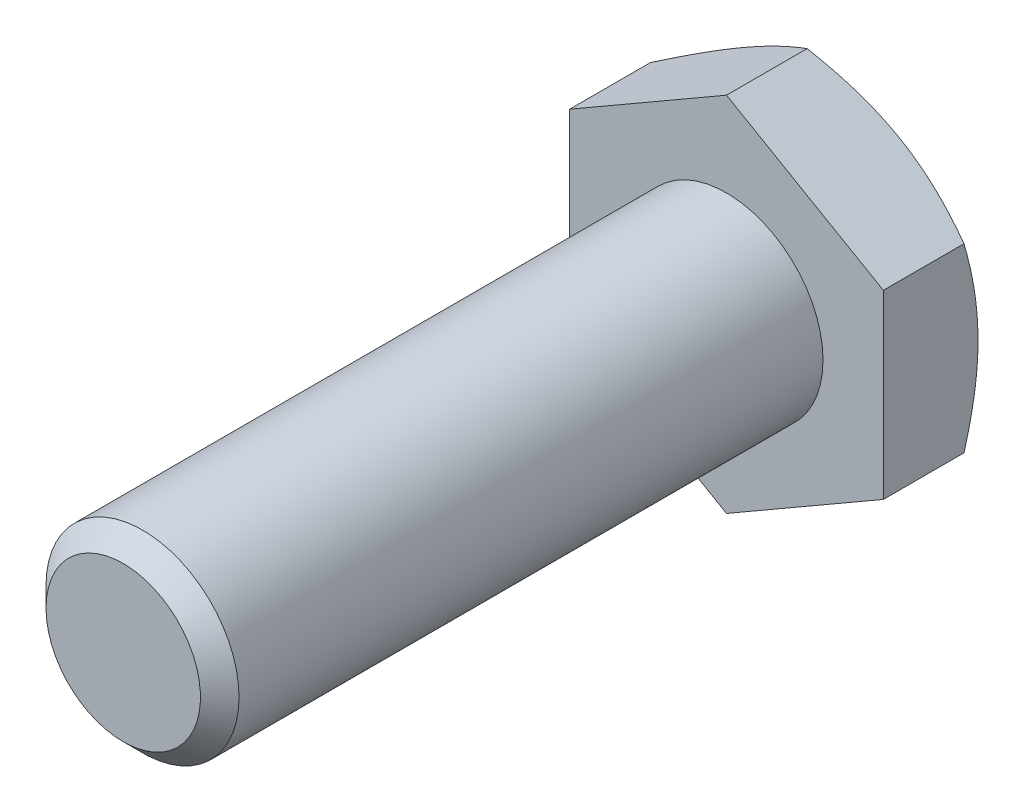
ISO-10303-21;
HEADER;
FILE_DESCRIPTION(('STEP AP214'),'2;1');
FILE_NAME('part.step','',(''),(''),'','','');
FILE_SCHEMA(('AUTOMOTIVE_DESIGN { 1 0 10303 214 1 1 1 1 }'));
ENDSEC;
DATA;
#1=APPLICATION_CONTEXT('core data for automotive mechanical design processes');
#2=APPLICATION_PROTOCOL_DEFINITION('international standard','automotive_design',2000,#1);
#3=PRODUCT_CONTEXT('',#1,'mechanical');
#4=PRODUCT('Part','Part','',(#3));
#5=PRODUCT_RELATED_PRODUCT_CATEGORY('part','',(#4));
#6=PRODUCT_DEFINITION_FORMATION('','',#4);
#7=PRODUCT_DEFINITION_CONTEXT('part definition',#1,'design');
#8=PRODUCT_DEFINITION('design','',#6,#7);
#9=PRODUCT_DEFINITION_SHAPE('','',#8);
#10=(LENGTH_UNIT() NAMED_UNIT(*) SI_UNIT(.MILLI.,.METRE.));
#11=(NAMED_UNIT(*) PLANE_ANGLE_UNIT() SI_UNIT($,.RADIAN.));
#12=(NAMED_UNIT(*) SI_UNIT($,.STERADIAN.) SOLID_ANGLE_UNIT());
#13=UNCERTAINTY_MEASURE_WITH_UNIT(LENGTH_MEASURE(1.E-05),#10,'distance_accuracy_value','');
#14=(GEOMETRIC_REPRESENTATION_CONTEXT(3) GLOBAL_UNCERTAINTY_ASSIGNED_CONTEXT((#13)) GLOBAL_UNIT_ASSIGNED_CONTEXT((#10,
#11,#12)) REPRESENTATION_CONTEXT('',''));
#15=CARTESIAN_POINT('',(0.,0.,0.));
#16=DIRECTION('',(0.,0.,1.));
#17=DIRECTION('',(1.,0.,0.));
#18=AXIS2_PLACEMENT_3D('',#15,#16,#17);
#19=CARTESIAN_POINT('',(0.,0.,25.));
#20=DIRECTION('',(0.,0.,1.));
#21=DIRECTION('',(1.,0.,0.));
#22=AXIS2_PLACEMENT_3D('',#19,#20,#21);
#23=PLANE('',#22);
#24=CARTESIAN_POINT('',(0.,0.,25.));
#25=DIRECTION('',(0.,0.,1.));
#26=DIRECTION('',(1.,0.,0.));
#27=AXIS2_PLACEMENT_3D('',#24,#25,#26);
#28=CIRCLE('',#27,3.2);
#29=CARTESIAN_POINT('',(-3.2,0.,25.));
#30=VERTEX_POINT('',#29);
#31=EDGE_CURVE('E38',#30,#30,#28,.T.);
#32=ORIENTED_EDGE('',*,*,#31,.T.);
#33=EDGE_LOOP('',(#32));
#34=FACE_BOUND('',#33,.T.);
#35=ADVANCED_FACE('F30',(#34),#23,.T.);
#36=CARTESIAN_POINT('',(0.,0.,0.));
#37=DIRECTION('',(0.,0.,1.));
#38=DIRECTION('',(1.,0.,0.));
#39=AXIS2_PLACEMENT_3D('',#36,#37,#38);
#40=CYLINDRICAL_SURFACE('',#39,4.);
#41=CARTESIAN_POINT('',(0.,0.,24.2));
#42=DIRECTION('',(0.,0.,1.));
#43=DIRECTION('',(1.,0.,0.));
#44=AXIS2_PLACEMENT_3D('',#41,#42,#43);
#45=CIRCLE('',#44,4.);
#46=CARTESIAN_POINT('',(-3.99999999999999,0.,24.2));
#47=VERTEX_POINT('',#46);
#48=EDGE_CURVE('E11',#47,#47,#45,.F.);
#49=ORIENTED_EDGE('',*,*,#48,.T.);
#50=EDGE_LOOP('',(#49));
#51=FACE_BOUND('',#50,.T.);
#52=CARTESIAN_POINT('',(0.,0.,0.));
#53=DIRECTION('',(0.,0.,1.));
#54=DIRECTION('',(1.,0.,0.));
#55=AXIS2_PLACEMENT_3D('',#52,#53,#54);
#56=CIRCLE('',#55,4.);
#57=CARTESIAN_POINT('',(4.,0.,0.));
#58=VERTEX_POINT('',#57);
#59=EDGE_CURVE('E113',#58,#58,#56,.F.);
#60=ORIENTED_EDGE('',*,*,#59,.F.);
#61=EDGE_LOOP('',(#60));
#62=FACE_BOUND('',#61,.T.);
#63=ADVANCED_FACE('F120',(#51,#62),#40,.T.);
#64=CARTESIAN_POINT('',(0.,0.,25.));
#65=DIRECTION('',(0.,0.,-1.));
#66=DIRECTION('',(-1.,0.,0.));
#67=AXIS2_PLACEMENT_3D('',#64,#65,#66);
#68=CONICAL_SURFACE('',#67,3.2,0.785398163397447);
#69=CARTESIAN_POINT('',(-3.99999999999999,0.,24.2));
#70=CARTESIAN_POINT('',(-3.99166666666666,0.,24.2083333333333));
#71=CARTESIAN_POINT('',(-3.98333333333333,0.,24.2166666666667));
#72=CARTESIAN_POINT('',(-3.96666666666666,0.,24.2333333333333));
#73=CARTESIAN_POINT('',(-3.95833333333333,0.,24.2416666666667));
#74=CARTESIAN_POINT('',(-3.94166666666666,0.,24.2583333333333));
#75=CARTESIAN_POINT('',(-3.93333333333333,0.,24.2666666666667));
#76=CARTESIAN_POINT('',(-3.91666666666666,0.,24.2833333333333));
#77=CARTESIAN_POINT('',(-3.90833333333333,0.,24.2916666666667));
#78=CARTESIAN_POINT('',(-3.89166666666666,0.,24.3083333333333));
#79=CARTESIAN_POINT('',(-3.88333333333333,0.,24.3166666666667));
#80=CARTESIAN_POINT('',(-3.86666666666666,0.,24.3333333333333));
#81=CARTESIAN_POINT('',(-3.85833333333333,0.,24.3416666666667));
#82=CARTESIAN_POINT('',(-3.84166666666666,0.,24.3583333333333));
#83=CARTESIAN_POINT('',(-3.83333333333333,0.,24.3666666666667));
#84=CARTESIAN_POINT('',(-3.81666666666666,0.,24.3833333333333));
#85=CARTESIAN_POINT('',(-3.80833333333333,0.,24.3916666666667));
#86=CARTESIAN_POINT('',(-3.79166666666666,0.,24.4083333333333));
#87=CARTESIAN_POINT('',(-3.78333333333333,0.,24.4166666666667));
#88=CARTESIAN_POINT('',(-3.76666666666666,0.,24.4333333333333));
#89=CARTESIAN_POINT('',(-3.75833333333333,0.,24.4416666666667));
#90=CARTESIAN_POINT('',(-3.74166666666666,0.,24.4583333333333));
#91=CARTESIAN_POINT('',(-3.73333333333333,0.,24.4666666666667));
#92=CARTESIAN_POINT('',(-3.71666666666666,0.,24.4833333333333));
#93=CARTESIAN_POINT('',(-3.70833333333333,0.,24.4916666666667));
#94=CARTESIAN_POINT('',(-3.69166666666666,0.,24.5083333333333));
#95=CARTESIAN_POINT('',(-3.68333333333333,0.,24.5166666666667));
#96=CARTESIAN_POINT('',(-3.66666666666666,0.,24.5333333333333));
#97=CARTESIAN_POINT('',(-3.65833333333333,0.,24.5416666666667));
#98=CARTESIAN_POINT('',(-3.64166666666666,0.,24.5583333333333));
#99=CARTESIAN_POINT('',(-3.63333333333333,0.,24.5666666666667));
#100=CARTESIAN_POINT('',(-3.61666666666666,0.,24.5833333333333));
#101=CARTESIAN_POINT('',(-3.60833333333333,0.,24.5916666666667));
#102=CARTESIAN_POINT('',(-3.59166666666666,0.,24.6083333333333));
#103=CARTESIAN_POINT('',(-3.58333333333333,0.,24.6166666666667));
#104=CARTESIAN_POINT('',(-3.56666666666666,0.,24.6333333333333));
#105=CARTESIAN_POINT('',(-3.55833333333333,0.,24.6416666666667));
#106=CARTESIAN_POINT('',(-3.54166666666666,0.,24.6583333333333));
#107=CARTESIAN_POINT('',(-3.53333333333333,0.,24.6666666666667));
#108=CARTESIAN_POINT('',(-3.51666666666666,0.,24.6833333333333));
#109=CARTESIAN_POINT('',(-3.50833333333333,0.,24.6916666666667));
#110=CARTESIAN_POINT('',(-3.49166666666666,0.,24.7083333333333));
#111=CARTESIAN_POINT('',(-3.48333333333333,0.,24.7166666666667));
#112=CARTESIAN_POINT('',(-3.46666666666666,0.,24.7333333333333));
#113=CARTESIAN_POINT('',(-3.45833333333333,0.,24.7416666666667));
#114=CARTESIAN_POINT('',(-3.44166666666667,0.,24.7583333333333));
#115=CARTESIAN_POINT('',(-3.43333333333333,0.,24.7666666666667));
#116=CARTESIAN_POINT('',(-3.41666666666666,0.,24.7833333333333));
#117=CARTESIAN_POINT('',(-3.40833333333333,0.,24.7916666666667));
#118=CARTESIAN_POINT('',(-3.39166666666666,0.,24.8083333333333));
#119=CARTESIAN_POINT('',(-3.38333333333333,0.,24.8166666666667));
#120=CARTESIAN_POINT('',(-3.36666666666666,0.,24.8333333333333));
#121=CARTESIAN_POINT('',(-3.35833333333333,0.,24.8416666666667));
#122=CARTESIAN_POINT('',(-3.34166666666667,0.,24.8583333333333));
#123=CARTESIAN_POINT('',(-3.33333333333333,0.,24.8666666666667));
#124=CARTESIAN_POINT('',(-3.31666666666667,0.,24.8833333333333));
#125=CARTESIAN_POINT('',(-3.30833333333333,0.,24.8916666666667));
#126=CARTESIAN_POINT('',(-3.29166666666666,0.,24.9083333333333));
#127=CARTESIAN_POINT('',(-3.28333333333333,0.,24.9166666666667));
#128=CARTESIAN_POINT('',(-3.26666666666667,0.,24.9333333333333));
#129=CARTESIAN_POINT('',(-3.25833333333333,0.,24.9416666666667));
#130=CARTESIAN_POINT('',(-3.24166666666667,0.,24.9583333333333));
#131=CARTESIAN_POINT('',(-3.23333333333333,0.,24.9666666666667));
#132=CARTESIAN_POINT('',(-3.21666666666667,0.,24.9833333333333));
#133=CARTESIAN_POINT('',(-3.20833333333333,0.,24.9916666666667));
#134=CARTESIAN_POINT('',(-3.2,0.,25.));
#135=B_SPLINE_CURVE_WITH_KNOTS('',3,(#69,#70,#71,#72,#73,#74,#75,#76,#77,#78,#79,#80,#81,#82,
#83,#84,#85,#86,#87,#88,#89,#90,#91,#92,#93,#94,#95,#96,#97,#98,#99,#100,#101,#102,#103,#104,
#105,#106,#107,#108,#109,#110,#111,#112,#113,#114,#115,#116,#117,#118,#119,#120,#121,#122,#123,
#124,#125,#126,#127,#128,#129,#130,#131,#132,#133,#134),.UNSPECIFIED.,.F.,.F.,(4,2,2,2,2,2,2,2,
2,2,2,2,2,2,2,2,2,2,2,2,2,2,2,2,2,2,2,2,2,2,2,2,4),(0.,0.0353553390593278,0.0707106781186556,
0.106066017177983,0.141421356237311,0.176776695296636,0.212132034355964,0.247487373415292,
0.28284271247462,0.318198051533947,0.353553390593273,0.388908729652601,0.424264068711928,
0.459619407771256,0.494974746830582,0.530330085889909,0.565685424949237,0.601040764008565,
0.636396103067893,0.671751442127218,0.707106781186546,0.742462120245874,0.777817459305201,
0.813172798364527,0.848528137423854,0.883883476483182,0.91923881554251,0.954594154601838,
0.989949493661163,1.02530483272049,1.06066017177982,1.09601551083915,1.13137084989847),.UNSPECIFIED.);
#136=EDGE_CURVE('BSEAM32',#47,#30,#135,.T.);
#137=ORIENTED_EDGE('',*,*,#48,.F.);
#138=ORIENTED_EDGE('',*,*,#31,.F.);
#139=ORIENTED_EDGE('',*,*,#136,.T.);
#140=ORIENTED_EDGE('',*,*,#136,.F.);
#141=EDGE_LOOP('',(#137,#139,#138,#140));
#142=FACE_BOUND('',#141,.T.);
#143=ADVANCED_FACE('F32',(#142),#68,.T.);
#144=CARTESIAN_POINT('',(0.,7.50555349946514,-4.5));
#145=DIRECTION('',(0.499999999999997,0.86602540378444,0.));
#146=DIRECTION('',(-0.86602540378444,0.499999999999997,0.));
#147=AXIS2_PLACEMENT_3D('',#144,#145,#146);
#148=PLANE('',#147);
#149=CARTESIAN_POINT('',(-0.000200000000031177,7.50566896951898,-3.3420264790045));
#150=CARTESIAN_POINT('',(0.14267745905885,7.4231786300702,-3.38964530773488));
#151=CARTESIAN_POINT('',(0.286087634534882,7.34038072665458,-3.43510303020766));
#152=CARTESIAN_POINT('',(0.574072631317165,7.17411251123976,-3.52110104878732));
#153=CARTESIAN_POINT('',(0.718647926571235,7.09064192560665,-3.56163922358234));
#154=CARTESIAN_POINT('',(1.15468865052001,6.83889369625719,-3.67507872968716));
#155=CARTESIAN_POINT('',(1.44787528284629,6.66962231516081,-3.73960192368163));
#156=CARTESIAN_POINT('',(1.88662374554435,6.41631077211556,-3.81526314726288));
#157=CARTESIAN_POINT('',(2.03087463649466,6.33302748139455,-3.83681687435338));
#158=CARTESIAN_POINT('',(2.32002821713806,6.16608458377294,-3.87295941620425));
#159=CARTESIAN_POINT('',(2.46493084809887,6.08242501078144,-3.88754884635071));
#160=CARTESIAN_POINT('',(2.7549877794283,5.91496056339807,-3.90939097830302));
#161=CARTESIAN_POINT('',(2.90014160605419,5.83115596252171,-3.91665200648826));
#162=CARTESIAN_POINT('',(3.19057533697493,5.66347396979288,-3.92368942822814));
#163=CARTESIAN_POINT('',(3.33585523723634,5.57959658026911,-3.92346605299817));
#164=CARTESIAN_POINT('',(3.73387594242648,5.34979921898454,-3.91256627229521));
#165=CARTESIAN_POINT('',(3.98648646102755,5.20395446807008,-3.89426791294096));
#166=CARTESIAN_POINT('',(4.49002967823567,4.91323365606637,-3.8362433893527));
#167=CARTESIAN_POINT('',(4.74096060593307,4.76835861741227,-3.79649739227213));
#168=CARTESIAN_POINT('',(5.24551722064431,4.47705272008733,-3.69714382760822));
#169=CARTESIAN_POINT('',(5.49907924143591,4.33065861912704,-3.63711530517234));
#170=CARTESIAN_POINT('',(6.00242193575904,4.04005357906495,-3.5008747383005));
#171=CARTESIAN_POINT('',(6.25220905555296,3.89583891821183,-3.42469469664677));
#172=CARTESIAN_POINT('',(6.5002,3.75266127967874,-3.3420264790045));
#173=B_SPLINE_CURVE_WITH_KNOTS('',3,(#149,#150,#151,#152,#153,#154,#155,#156,#157,#158,#159,
#160,#161,#162,#163,#164,#165,#166,#167,#168,#169,#170,#171,#172),.UNSPECIFIED.,.F.,.F.,(4,2,2,
2,2,2,2,2,2,2,2,4),(0.,0.515105052395588,1.03043143507525,2.06322554824263,2.56697389547997,
3.07067772176454,3.57380860368928,4.07692394242521,4.95279354705661,5.82947446853468,
6.72559912449738,7.61996451221048),.UNSPECIFIED.);
#174=CARTESIAN_POINT('',(0.,7.50555349946514,-3.3420931472096));
#175=VERTEX_POINT('',#174);
#176=CARTESIAN_POINT('',(6.5,3.75277674973258,-3.3420931472096));
#177=VERTEX_POINT('',#176);
#178=EDGE_CURVE('E86',#175,#177,#173,.T.);
#179=ORIENTED_EDGE('',*,*,#178,.F.);
#180=DIRECTION('',(0.,0.,1.));
#181=VECTOR('',#180,1.);
#182=CARTESIAN_POINT('',(0.,7.50555349946514,-4.5));
#183=LINE('',#182,#181);
#184=CARTESIAN_POINT('',(0.,7.50555349946514,0.));
#185=VERTEX_POINT('',#184);
#186=EDGE_CURVE('E94',#175,#185,#183,.T.);
#187=ORIENTED_EDGE('',*,*,#186,.T.);
#188=DIRECTION('',(-0.86602540378444,0.499999999999997,0.));
#189=VECTOR('',#188,1.);
#190=CARTESIAN_POINT('',(0.,7.50555349946514,0.));
#191=LINE('',#190,#189);
#192=CARTESIAN_POINT('',(6.5,3.75277674973258,0.));
#193=VERTEX_POINT('',#192);
#194=EDGE_CURVE('E96',#193,#185,#191,.T.);
#195=ORIENTED_EDGE('',*,*,#194,.F.);
#196=DIRECTION('',(0.,0.,1.));
#197=VECTOR('',#196,1.);
#198=CARTESIAN_POINT('',(6.5,3.75277674973258,-4.5));
#199=LINE('',#198,#197);
#200=EDGE_CURVE('E53',#177,#193,#199,.T.);
#201=ORIENTED_EDGE('',*,*,#200,.F.);
#202=EDGE_LOOP('',(#179,#187,#195,#201));
#203=FACE_BOUND('',#202,.T.);
#204=ADVANCED_FACE('F93',(#203),#148,.T.);
#205=CARTESIAN_POINT('',(6.5,-3.75277674973258,-4.5));
#206=DIRECTION('',(1.,0.,0.));
#207=DIRECTION('',(0.,0.,-1.));
#208=AXIS2_PLACEMENT_3D('',#205,#206,#207);
#209=PLANE('',#208);
#210=CARTESIAN_POINT('',(6.5,-10.0244904016897,-0.777590882483481));
#211=CARTESIAN_POINT('',(6.5,-9.7409846558696,-0.914890658415324));
#212=CARTESIAN_POINT('',(6.5,-9.45682189549218,-1.05085734937978));
#213=CARTESIAN_POINT('',(6.5,-8.88683258896927,-1.31937339127567));
#214=CARTESIAN_POINT('',(6.5,-8.60100578371626,-1.45192219156385));
#215=CARTESIAN_POINT('',(6.5,-8.02583973014198,-1.71352978188609));
#216=CARTESIAN_POINT('',(6.5,-7.73648979454555,-1.84256515729875));
#217=CARTESIAN_POINT('',(6.5,-7.15546794918835,-2.09527760430403));
#218=CARTESIAN_POINT('',(6.5,-6.86379615180709,-2.21895493338512));
#219=CARTESIAN_POINT('',(6.5,-6.26862128948201,-2.46324697585851));
#220=CARTESIAN_POINT('',(6.5,-5.96503072061814,-2.58364967449394));
#221=CARTESIAN_POINT('',(6.5,-5.35427737454438,-2.815206238306));
#222=CARTESIAN_POINT('',(6.5,-5.04711419818323,-2.92635905849961));
#223=CARTESIAN_POINT('',(6.5,-4.42932069898301,-3.1364582634175));
#224=CARTESIAN_POINT('',(6.5,-4.11869901989562,-3.23542981159286));
#225=CARTESIAN_POINT('',(6.5,-3.49299840897086,-3.41795344651536));
#226=CARTESIAN_POINT('',(6.5,-3.17792093180879,-3.50151044596571));
#227=CARTESIAN_POINT('',(6.5,-2.54480467713488,-3.64874120746188));
#228=CARTESIAN_POINT('',(6.5,-2.22678976887275,-3.71251595290877));
#229=CARTESIAN_POINT('',(6.5,-1.58682147389571,-3.81649514049711));
#230=CARTESIAN_POINT('',(6.5,-1.26486846580929,-3.85670183068476));
#231=CARTESIAN_POINT('',(6.5,-0.782403116766341,-3.89666482700005));
#232=CARTESIAN_POINT('',(6.5,-0.622692720623837,-3.90659457592341));
#233=CARTESIAN_POINT('',(6.5,-0.302988170226759,-3.91970114214452));
#234=CARTESIAN_POINT('',(6.5,-0.142994020659131,-3.92287806996237));
#235=CARTESIAN_POINT('',(6.5,0.176985770137266,-3.92239573428391));
#236=CARTESIAN_POINT('',(6.5,0.336971411164822,-3.91873634954926));
#237=CARTESIAN_POINT('',(6.5,0.656648488771374,-3.90467170408133));
#238=CARTESIAN_POINT('',(6.5,0.816339909796932,-3.89426609643183));
#239=CARTESIAN_POINT('',(6.5,1.20171869188174,-3.86123171063583));
#240=CARTESIAN_POINT('',(6.5,1.42712981692754,-3.835313819056));
#241=CARTESIAN_POINT('',(6.5,1.87623262277691,-3.77146176226375));
#242=CARTESIAN_POINT('',(6.5,2.09992405972164,-3.73352592391463));
#243=CARTESIAN_POINT('',(6.5,2.76817919252598,-3.60370718872716));
#244=CARTESIAN_POINT('',(6.5,3.2096755777397,-3.49583710872219));
#245=CARTESIAN_POINT('',(6.5,3.8700028385196,-3.30931018541086));
#246=CARTESIAN_POINT('',(6.5,4.09226797348255,-3.24211759145675));
#247=CARTESIAN_POINT('',(6.5,4.53463717531212,-3.10089633085077));
#248=CARTESIAN_POINT('',(6.5,4.75474122641926,-3.0268676143881));
#249=CARTESIAN_POINT('',(6.5,5.19286351792451,-2.87315046023767));
#250=CARTESIAN_POINT('',(6.5,5.41088242797652,-2.79346391393304));
#251=CARTESIAN_POINT('',(6.5,5.84512013498244,-2.62935477221528));
#252=CARTESIAN_POINT('',(6.5,6.06133896660767,-2.54493226826495));
#253=CARTESIAN_POINT('',(6.5,6.62646224939016,-2.31829550178156));
#254=CARTESIAN_POINT('',(6.5,6.97407203007465,-2.1728566277625));
#255=CARTESIAN_POINT('',(6.5,7.66593049582626,-1.87416698258059));
#256=CARTESIAN_POINT('',(6.5,8.01017886882466,-1.72091549416839));
#257=CARTESIAN_POINT('',(6.5,8.69605829239833,-1.40839419153704));
#258=CARTESIAN_POINT('',(6.5,9.0376884645769,-1.24912245546136));
#259=CARTESIAN_POINT('',(6.5,9.71873297838008,-0.925952915120549));
#260=CARTESIAN_POINT('',(6.5,10.0581473936709,-0.762055265625316));
#261=CARTESIAN_POINT('',(6.5,10.7356612599491,-0.430378782828575));
#262=CARTESIAN_POINT('',(6.5,11.0737581990929,-0.262594828590776));
#263=CARTESIAN_POINT('',(6.5,11.7484857221051,0.0758971643313238));
#264=CARTESIAN_POINT('',(6.5,12.0851162959529,0.246605222958636));
#265=CARTESIAN_POINT('',(6.5,12.7571035621773,0.590355004418772));
#266=CARTESIAN_POINT('',(6.5,13.0924604795891,0.763396287828086));
#267=CARTESIAN_POINT('',(6.5,13.762166406736,1.11141943867752));
#268=CARTESIAN_POINT('',(6.5,14.0965154127158,1.28640131333645));
#269=CARTESIAN_POINT('',(6.5,15.0315841825479,1.7786258547562));
#270=CARTESIAN_POINT('',(6.5,15.6313608182325,2.09765985291756));
#271=CARTESIAN_POINT('',(6.5,16.8289183001143,2.73951763690203));
#272=CARTESIAN_POINT('',(6.5,17.4266990414333,3.06234161797418));
#273=CARTESIAN_POINT('',(6.5,18.6189517518862,3.7098623360343));
#274=CARTESIAN_POINT('',(6.5,19.213428276938,4.03455069250977));
#275=CARTESIAN_POINT('',(6.5,20.401131504517,4.68611026182365));
#276=CARTESIAN_POINT('',(6.5,20.9943582897142,5.01298132390526));
#277=CARTESIAN_POINT('',(6.5,21.5871414725445,5.3406491819555));
#278=B_SPLINE_CURVE_WITH_KNOTS('',3,(#210,#211,#212,#213,#214,#215,#216,#217,#218,#219,#220,
#221,#222,#223,#224,#225,#226,#227,#228,#229,#230,#231,#232,#233,#234,#235,#236,#237,#238,#239,
#240,#241,#242,#243,#244,#245,#246,#247,#248,#249,#250,#251,#252,#253,#254,#255,#256,#257,#258,
#259,#260,#261,#262,#263,#264,#265,#266,#267,#268,#269,#270,#271,#272,#273,#274,#275,#276,#277),
.UNSPECIFIED.,.F.,.F.,(4,2,2,2,2,2,2,2,2,2,2,2,2,2,2,2,2,2,2,2,2,2,2,2,2,2,2,2,2,2,2,2,2,4),(0.,
0.94502010978529,1.89019152875864,2.84060145214108,3.79096565145805,4.77063316983372,
5.75041121399257,6.72813004498673,7.70553673113412,8.67786861551527,9.65010773862232,
10.1300430029345,10.6099704123222,11.0899063330465,11.5698669358428,12.2501706609106,
12.9305691394118,14.2921106390284,14.988652885068,15.6852002068034,16.3815157628814,
17.0778178760471,18.2081046222835,19.3384953238036,20.4692499815985,21.5999668523011,
22.7322695414204,23.8645799561612,24.9966800180572,26.128784292666,28.1668095286967,
30.2049402227155,32.2370333644472,34.2689875745551),.UNSPECIFIED.);
#279=CARTESIAN_POINT('',(6.5,-3.75277674973258,-3.3420931472096));
#280=VERTEX_POINT('',#279);
#281=EDGE_CURVE('E97',#177,#280,#278,.F.);
#282=ORIENTED_EDGE('',*,*,#281,.F.);
#283=ORIENTED_EDGE('',*,*,#200,.T.);
#284=DIRECTION('',(0.,1.,0.));
#285=VECTOR('',#284,1.);
#286=CARTESIAN_POINT('',(6.5,-3.75277674973258,0.));
#287=LINE('',#286,#285);
#288=CARTESIAN_POINT('',(6.5,-3.75277674973258,0.));
#289=VERTEX_POINT('',#288);
#290=EDGE_CURVE('E104',#289,#193,#287,.T.);
#291=ORIENTED_EDGE('',*,*,#290,.F.);
#292=DIRECTION('',(0.,0.,1.));
#293=VECTOR('',#292,1.);
#294=CARTESIAN_POINT('',(6.5,-3.75277674973258,-4.5));
#295=LINE('',#294,#293);
#296=EDGE_CURVE('E205',#280,#289,#295,.T.);
#297=ORIENTED_EDGE('',*,*,#296,.F.);
#298=EDGE_LOOP('',(#282,#283,#291,#297));
#299=FACE_BOUND('',#298,.T.);
#300=ADVANCED_FACE('F126',(#299),#209,.T.);
#301=CARTESIAN_POINT('',(0.,-7.50555349946514,-4.5));
#302=DIRECTION('',(0.499999999999997,-0.86602540378444,0.));
#303=DIRECTION('',(0.86602540378444,0.499999999999997,0.));
#304=AXIS2_PLACEMENT_3D('',#301,#302,#303);
#305=PLANE('',#304);
#306=CARTESIAN_POINT('',(6.5002,-3.75266127967874,-3.3420264790045));
#307=CARTESIAN_POINT('',(6.35732254094112,-3.83515161912752,-3.38964530773488));
#308=CARTESIAN_POINT('',(6.21391236546509,-3.91794952254313,-3.43510303020766));
#309=CARTESIAN_POINT('',(5.9259273686828,-4.08421773795796,-3.52110104878732));
#310=CARTESIAN_POINT('',(5.78135207342873,-4.16768832359106,-3.56163922358234));
#311=CARTESIAN_POINT('',(5.34531134947996,-4.41943655294052,-3.67507872968716));
#312=CARTESIAN_POINT('',(5.05212471715367,-4.5887079340369,-3.73960192368163));
#313=CARTESIAN_POINT('',(4.61337625445562,-4.84201947708216,-3.81526314726288));
#314=CARTESIAN_POINT('',(4.4691253635053,-4.92530276780317,-3.83681687435338));
#315=CARTESIAN_POINT('',(4.1799717828619,-5.09224566542478,-3.87295941620425));
#316=CARTESIAN_POINT('',(4.0350691519011,-5.17590523841628,-3.8875488463507));
#317=CARTESIAN_POINT('',(3.74501222057167,-5.34336968579964,-3.90939097830302));
#318=CARTESIAN_POINT('',(3.59985839394578,-5.427174286676,-3.91665200648826));
#319=CARTESIAN_POINT('',(3.30942466302504,-5.59485627940484,-3.92368942822814));
#320=CARTESIAN_POINT('',(3.16414476276363,-5.67873366892861,-3.92346605299817));
#321=CARTESIAN_POINT('',(2.76612405757349,-5.90853103021318,-3.91256627229521));
#322=CARTESIAN_POINT('',(2.51351353897241,-6.05437578112764,-3.89426791294096));
#323=CARTESIAN_POINT('',(2.0099703217643,-6.34509659313135,-3.8362433893527));
#324=CARTESIAN_POINT('',(1.7590393940669,-6.48997163178545,-3.79649739227213));
#325=CARTESIAN_POINT('',(1.25448277935565,-6.78127752911039,-3.69714382760822));
#326=CARTESIAN_POINT('',(1.00092075856406,-6.92767163007068,-3.63711530517234));
#327=CARTESIAN_POINT('',(0.497578064240927,-7.21827667013277,-3.5008747383005));
#328=CARTESIAN_POINT('',(0.247790944447006,-7.36249133098589,-3.42469469664677));
#329=CARTESIAN_POINT('',(-0.00020000000003017,-7.50566896951897,-3.3420264790045));
#330=B_SPLINE_CURVE_WITH_KNOTS('',3,(#306,#307,#308,#309,#310,#311,#312,#313,#314,#315,#316,
#317,#318,#319,#320,#321,#322,#323,#324,#325,#326,#327,#328,#329),.UNSPECIFIED.,.F.,.F.,(4,2,2,
2,2,2,2,2,2,2,2,4),(0.,0.515105052395588,1.03043143507525,2.06322554824263,2.56697389547997,
3.07067772176454,3.57380860368928,4.07692394242521,4.95279354705661,5.82947446853468,
6.72559912449738,7.61996451221048),.UNSPECIFIED.);
#331=CARTESIAN_POINT('',(0.,-7.50555349946514,-3.3420931472096));
#332=VERTEX_POINT('',#331);
#333=EDGE_CURVE('E175',#280,#332,#330,.T.);
#334=ORIENTED_EDGE('',*,*,#333,.F.);
#335=ORIENTED_EDGE('',*,*,#296,.T.);
#336=DIRECTION('',(0.86602540378444,0.499999999999997,0.));
#337=VECTOR('',#336,1.);
#338=CARTESIAN_POINT('',(0.,-7.50555349946514,0.));
#339=LINE('',#338,#337);
#340=CARTESIAN_POINT('',(0.,-7.50555349946514,0.));
#341=VERTEX_POINT('',#340);
#342=EDGE_CURVE('E109',#341,#289,#339,.T.);
#343=ORIENTED_EDGE('',*,*,#342,.F.);
#344=DIRECTION('',(0.,0.,1.));
#345=VECTOR('',#344,1.);
#346=CARTESIAN_POINT('',(0.,-7.50555349946514,-4.5));
#347=LINE('',#346,#345);
#348=EDGE_CURVE('E204',#332,#341,#347,.T.);
#349=ORIENTED_EDGE('',*,*,#348,.F.);
#350=EDGE_LOOP('',(#334,#335,#343,#349));
#351=FACE_BOUND('',#350,.T.);
#352=ADVANCED_FACE('F180',(#351),#305,.T.);
#353=CARTESIAN_POINT('',(0.,-7.50555349946514,-4.5));
#354=DIRECTION('',(-0.500000000000001,-0.866025403784438,0.));
#355=DIRECTION('',(0.866025403784438,-0.500000000000001,0.));
#356=AXIS2_PLACEMENT_3D('',#353,#354,#355);
#357=PLANE('',#356);
#358=CARTESIAN_POINT('',(0.000199999999968727,-7.50566896951898,-3.3420264790045));
#359=CARTESIAN_POINT('',(-0.142677459058911,-7.4231786300702,-3.38964530773488));
#360=CARTESIAN_POINT('',(-0.286087634534944,-7.34038072665458,-3.43510303020766));
#361=CARTESIAN_POINT('',(-0.574072631317226,-7.17411251123976,-3.52110104878732));
#362=CARTESIAN_POINT('',(-0.718647926571295,-7.09064192560665,-3.56163922358234));
#363=CARTESIAN_POINT('',(-1.15468865052007,-6.83889369625719,-3.67507872968716));
#364=CARTESIAN_POINT('',(-1.44787528284635,-6.66962231516081,-3.73960192368163));
#365=CARTESIAN_POINT('',(-1.88662374554441,-6.41631077211555,-3.81526314726287));
#366=CARTESIAN_POINT('',(-2.03087463649472,-6.33302748139454,-3.83681687435338));
#367=CARTESIAN_POINT('',(-2.32002821713812,-6.16608458377293,-3.87295941620425));
#368=CARTESIAN_POINT('',(-2.46493084809892,-6.08242501078143,-3.8875488463507));
#369=CARTESIAN_POINT('',(-2.75498777942836,-5.91496056339806,-3.90939097830302));
#370=CARTESIAN_POINT('',(-2.90014160605425,-5.8311559625217,-3.91665200648826));
#371=CARTESIAN_POINT('',(-3.19057533697498,-5.66347396979286,-3.92368942822813));
#372=CARTESIAN_POINT('',(-3.33585523723639,-5.5795965802691,-3.92346605299816));
#373=CARTESIAN_POINT('',(-3.73387594242653,-5.34979921898453,-3.9125662722952));
#374=CARTESIAN_POINT('',(-3.9864864610276,-5.20395446807007,-3.89426791294095));
#375=CARTESIAN_POINT('',(-4.4900296782357,-4.91323365606636,-3.83624338935269));
#376=CARTESIAN_POINT('',(-4.7409606059331,-4.76835861741226,-3.79649739227212));
#377=CARTESIAN_POINT('',(-5.24551722064434,-4.47705272008732,-3.69714382760821));
#378=CARTESIAN_POINT('',(-5.49907924143592,-4.33065861912703,-3.63711530517233));
#379=CARTESIAN_POINT('',(-6.00242193575905,-4.04005357906495,-3.50087473830049));
#380=CARTESIAN_POINT('',(-6.25220905555296,-3.89583891821183,-3.42469469664677));
#381=CARTESIAN_POINT('',(-6.5002,-3.75266127967874,-3.3420264790045));
#382=B_SPLINE_CURVE_WITH_KNOTS('',3,(#358,#359,#360,#361,#362,#363,#364,#365,#366,#367,#368,
#369,#370,#371,#372,#373,#374,#375,#376,#377,#378,#379,#380,#381),.UNSPECIFIED.,.F.,.F.,(4,2,2,
2,2,2,2,2,2,2,2,4),(0.,0.515105052395588,1.03043143507525,2.06322554824263,2.56697389547997,
3.07067772176454,3.57380860368928,4.07692394242521,4.9527935470566,5.82947446853465,
6.72559912449734,7.61996451221042),.UNSPECIFIED.);
#383=CARTESIAN_POINT('',(-6.5,-3.75277674973258,-3.3420931472096));
#384=VERTEX_POINT('',#383);
#385=EDGE_CURVE('E170',#332,#384,#382,.T.);
#386=ORIENTED_EDGE('',*,*,#385,.F.);
#387=ORIENTED_EDGE('',*,*,#348,.T.);
#388=DIRECTION('',(0.866025403784438,-0.500000000000001,0.));
#389=VECTOR('',#388,1.);
#390=CARTESIAN_POINT('',(0.,-7.50555349946514,0.));
#391=LINE('',#390,#389);
#392=CARTESIAN_POINT('',(-6.5,-3.75277674973258,0.));
#393=VERTEX_POINT('',#392);
#394=EDGE_CURVE('E202',#393,#341,#391,.T.);
#395=ORIENTED_EDGE('',*,*,#394,.F.);
#396=DIRECTION('',(0.,0.,1.));
#397=VECTOR('',#396,1.);
#398=CARTESIAN_POINT('',(-6.5,-3.75277674973258,-4.5));
#399=LINE('',#398,#397);
#400=EDGE_CURVE('E106',#384,#393,#399,.T.);
#401=ORIENTED_EDGE('',*,*,#400,.F.);
#402=EDGE_LOOP('',(#386,#387,#395,#401));
#403=FACE_BOUND('',#402,.T.);
#404=ADVANCED_FACE('F183',(#403),#357,.T.);
#405=CARTESIAN_POINT('',(-6.5,-3.75277674973258,-4.5));
#406=DIRECTION('',(-1.,0.,0.));
#407=DIRECTION('',(0.,0.,1.));
#408=AXIS2_PLACEMENT_3D('',#405,#406,#407);
#409=PLANE('',#408);
#410=CARTESIAN_POINT('',(-6.5,-10.0244904016897,-0.777590882483481));
#411=CARTESIAN_POINT('',(-6.5,-9.7409846558696,-0.914890658415324));
#412=CARTESIAN_POINT('',(-6.5,-9.45682189549217,-1.05085734937978));
#413=CARTESIAN_POINT('',(-6.5,-8.88683258896927,-1.31937339127566));
#414=CARTESIAN_POINT('',(-6.5,-8.60100578371626,-1.45192219156385));
#415=CARTESIAN_POINT('',(-6.5,-8.02583973014198,-1.71352978188609));
#416=CARTESIAN_POINT('',(-6.5,-7.73648979454555,-1.84256515729875));
#417=CARTESIAN_POINT('',(-6.5,-7.15546794918835,-2.09527760430403));
#418=CARTESIAN_POINT('',(-6.5,-6.86379615180709,-2.21895493338512));
#419=CARTESIAN_POINT('',(-6.5,-6.26862128948201,-2.46324697585851));
#420=CARTESIAN_POINT('',(-6.5,-5.96503072061815,-2.58364967449394));
#421=CARTESIAN_POINT('',(-6.5,-5.35427737454438,-2.81520623830599));
#422=CARTESIAN_POINT('',(-6.5,-5.04711419818323,-2.92635905849961));
#423=CARTESIAN_POINT('',(-6.5,-4.42932069898301,-3.1364582634175));
#424=CARTESIAN_POINT('',(-6.5,-4.11869901989562,-3.23542981159286));
#425=CARTESIAN_POINT('',(-6.5,-3.49299840897086,-3.41795344651536));
#426=CARTESIAN_POINT('',(-6.5,-3.17792093180879,-3.50151044596571));
#427=CARTESIAN_POINT('',(-6.5,-2.54480467713488,-3.64874120746188));
#428=CARTESIAN_POINT('',(-6.5,-2.22678976887275,-3.71251595290877));
#429=CARTESIAN_POINT('',(-6.5,-1.58682147389571,-3.81649514049711));
#430=CARTESIAN_POINT('',(-6.5,-1.26486846580929,-3.85670183068475));
#431=CARTESIAN_POINT('',(-6.5,-0.782403116766342,-3.89666482700005));
#432=CARTESIAN_POINT('',(-6.5,-0.622692720623837,-3.90659457592341));
#433=CARTESIAN_POINT('',(-6.5,-0.30298817022676,-3.91970114214452));
#434=CARTESIAN_POINT('',(-6.5,-0.142994020659134,-3.92287806996237));
#435=CARTESIAN_POINT('',(-6.5,0.176985770137263,-3.92239573428391));
#436=CARTESIAN_POINT('',(-6.5,0.33697141116482,-3.91873634954926));
#437=CARTESIAN_POINT('',(-6.5,0.656648488771371,-3.90467170408133));
#438=CARTESIAN_POINT('',(-6.5,0.816339909796931,-3.89426609643183));
#439=CARTESIAN_POINT('',(-6.5,1.20171869188174,-3.86123171063583));
#440=CARTESIAN_POINT('',(-6.5,1.42712981692754,-3.835313819056));
#441=CARTESIAN_POINT('',(-6.5,1.87623262277691,-3.77146176226375));
#442=CARTESIAN_POINT('',(-6.5,2.09992405972164,-3.73352592391462));
#443=CARTESIAN_POINT('',(-6.5,2.76817919252598,-3.60370718872716));
#444=CARTESIAN_POINT('',(-6.5,3.2096755777397,-3.49583710872218));
#445=CARTESIAN_POINT('',(-6.5,3.8700028385196,-3.30931018541086));
#446=CARTESIAN_POINT('',(-6.5,4.09226797348255,-3.24211759145675));
#447=CARTESIAN_POINT('',(-6.5,4.53463717531212,-3.10089633085077));
#448=CARTESIAN_POINT('',(-6.5,4.75474122641925,-3.0268676143881));
#449=CARTESIAN_POINT('',(-6.5,5.19286351792451,-2.87315046023767));
#450=CARTESIAN_POINT('',(-6.5,5.41088242797652,-2.79346391393304));
#451=CARTESIAN_POINT('',(-6.5,5.84512013498244,-2.62935477221528));
#452=CARTESIAN_POINT('',(-6.5,6.06133896660767,-2.54493226826495));
#453=CARTESIAN_POINT('',(-6.5,6.62646224939016,-2.31829550178156));
#454=CARTESIAN_POINT('',(-6.5,6.97407203007464,-2.1728566277625));
#455=CARTESIAN_POINT('',(-6.5,7.66593049582626,-1.87416698258059));
#456=CARTESIAN_POINT('',(-6.5,8.01017886882466,-1.72091549416839));
#457=CARTESIAN_POINT('',(-6.5,8.69605829239833,-1.40839419153704));
#458=CARTESIAN_POINT('',(-6.5,9.0376884645769,-1.24912245546136));
#459=CARTESIAN_POINT('',(-6.5,9.71873297838008,-0.925952915120548));
#460=CARTESIAN_POINT('',(-6.5,10.0581473936709,-0.762055265625316));
#461=CARTESIAN_POINT('',(-6.5,10.7356612599491,-0.430378782828576));
#462=CARTESIAN_POINT('',(-6.5,11.0737581990929,-0.262594828590775));
#463=CARTESIAN_POINT('',(-6.5,11.748485722105,0.0758971643313248));
#464=CARTESIAN_POINT('',(-6.5,12.0851162959529,0.246605222958636));
#465=CARTESIAN_POINT('',(-6.5,12.7571035621773,0.590355004418772));
#466=CARTESIAN_POINT('',(-6.5,13.0924604795891,0.763396287828085));
#467=CARTESIAN_POINT('',(-6.5,13.762166406736,1.11141943867752));
#468=CARTESIAN_POINT('',(-6.5,14.0965154127157,1.28640131333645));
#469=CARTESIAN_POINT('',(-6.5,15.0315841825479,1.77862585475621));
#470=CARTESIAN_POINT('',(-6.5,15.6313608182325,2.09765985291756));
#471=CARTESIAN_POINT('',(-6.5,16.8289183001143,2.73951763690203));
#472=CARTESIAN_POINT('',(-6.5,17.4266990414333,3.06234161797418));
#473=CARTESIAN_POINT('',(-6.5,18.6189517518862,3.7098623360343));
#474=CARTESIAN_POINT('',(-6.5,19.213428276938,4.03455069250977));
#475=CARTESIAN_POINT('',(-6.5,20.401131504517,4.68611026182365));
#476=CARTESIAN_POINT('',(-6.5,20.9943582897142,5.01298132390526));
#477=CARTESIAN_POINT('',(-6.5,21.5871414725445,5.3406491819555));
#478=B_SPLINE_CURVE_WITH_KNOTS('',3,(#410,#411,#412,#413,#414,#415,#416,#417,#418,#419,#420,
#421,#422,#423,#424,#425,#426,#427,#428,#429,#430,#431,#432,#433,#434,#435,#436,#437,#438,#439,
#440,#441,#442,#443,#444,#445,#446,#447,#448,#449,#450,#451,#452,#453,#454,#455,#456,#457,#458,
#459,#460,#461,#462,#463,#464,#465,#466,#467,#468,#469,#470,#471,#472,#473,#474,#475,#476,#477),
.UNSPECIFIED.,.F.,.F.,(4,2,2,2,2,2,2,2,2,2,2,2,2,2,2,2,2,2,2,2,2,2,2,2,2,2,2,2,2,2,2,2,2,4),(0.,
0.945020109785286,1.89019152875863,2.84060145214108,3.79096565145804,4.77063316983372,
5.75041121399256,6.72813004498672,7.70553673113411,8.67786861551526,9.65010773862232,
10.1300430029345,10.6099704123222,11.0899063330465,11.5698669358428,12.2501706609106,
12.9305691394118,14.2921106390284,14.9886528850679,15.6852002068034,16.3815157628814,
17.0778178760471,18.2081046222835,19.3384953238036,20.4692499815985,21.5999668523011,
22.7322695414203,23.8645799561612,24.9966800180572,26.128784292666,28.1668095286967,
30.2049402227155,32.2370333644472,34.2689875745551),.UNSPECIFIED.);
#479=CARTESIAN_POINT('',(-6.5,3.75277674973258,-3.3420931472096));
#480=VERTEX_POINT('',#479);
#481=EDGE_CURVE('E45',#384,#480,#478,.T.);
#482=ORIENTED_EDGE('',*,*,#481,.F.);
#483=ORIENTED_EDGE('',*,*,#400,.T.);
#484=DIRECTION('',(0.,-1.,0.));
#485=VECTOR('',#484,1.);
#486=CARTESIAN_POINT('',(-6.5,-3.75277674973258,0.));
#487=LINE('',#486,#485);
#488=CARTESIAN_POINT('',(-6.5,3.75277674973258,0.));
#489=VERTEX_POINT('',#488);
#490=EDGE_CURVE('E213',#489,#393,#487,.T.);
#491=ORIENTED_EDGE('',*,*,#490,.F.);
#492=DIRECTION('',(0.,0.,1.));
#493=VECTOR('',#492,1.);
#494=CARTESIAN_POINT('',(-6.5,3.75277674973258,-4.5));
#495=LINE('',#494,#493);
#496=EDGE_CURVE('E103',#480,#489,#495,.T.);
#497=ORIENTED_EDGE('',*,*,#496,.F.);
#498=EDGE_LOOP('',(#482,#483,#491,#497));
#499=FACE_BOUND('',#498,.T.);
#500=ADVANCED_FACE('F188',(#499),#409,.T.);
#501=CARTESIAN_POINT('',(-6.5,3.75277674973258,-4.5));
#502=DIRECTION('',(-0.500000000000001,0.866025403784438,0.));
#503=DIRECTION('',(-0.866025403784438,-0.500000000000001,0.));
#504=AXIS2_PLACEMENT_3D('',#501,#502,#503);
#505=PLANE('',#504);
#506=CARTESIAN_POINT('',(-6.5002,3.75266127967874,-3.34202647900449));
#507=CARTESIAN_POINT('',(-6.35732254094112,3.83515161912752,-3.38964530773488));
#508=CARTESIAN_POINT('',(-6.21391236546509,3.91794952254314,-3.43510303020766));
#509=CARTESIAN_POINT('',(-5.9259273686828,4.08421773795796,-3.52110104878732));
#510=CARTESIAN_POINT('',(-5.78135207342873,4.16768832359107,-3.56163922358234));
#511=CARTESIAN_POINT('',(-5.34531134947996,4.41943655294053,-3.67507872968716));
#512=CARTESIAN_POINT('',(-5.05212471715368,4.58870793403691,-3.73960192368163));
#513=CARTESIAN_POINT('',(-4.61337625445562,4.84201947708217,-3.81526314726287));
#514=CARTESIAN_POINT('',(-4.46912536350531,4.92530276780318,-3.83681687435338));
#515=CARTESIAN_POINT('',(-4.17997178286191,5.09224566542479,-3.87295941620425));
#516=CARTESIAN_POINT('',(-4.03506915190111,5.17590523841629,-3.8875488463507));
#517=CARTESIAN_POINT('',(-3.74501222057167,5.34336968579966,-3.90939097830302));
#518=CARTESIAN_POINT('',(-3.59985839394578,5.42717428667602,-3.91665200648826));
#519=CARTESIAN_POINT('',(-3.30942466302504,5.59485627940485,-3.92368942822813));
#520=CARTESIAN_POINT('',(-3.16414476276364,5.67873366892862,-3.92346605299816));
#521=CARTESIAN_POINT('',(-2.7661240575735,5.90853103021319,-3.9125662722952));
#522=CARTESIAN_POINT('',(-2.51351353897243,6.05437578112765,-3.89426791294095));
#523=CARTESIAN_POINT('',(-2.00997032176433,6.34509659313136,-3.83624338935269));
#524=CARTESIAN_POINT('',(-1.75903939406693,6.48997163178546,-3.79649739227212));
#525=CARTESIAN_POINT('',(-1.25448277935569,6.78127752911039,-3.69714382760821));
#526=CARTESIAN_POINT('',(-1.00092075856411,6.92767163007068,-3.63711530517234));
#527=CARTESIAN_POINT('',(-0.49757806424098,7.21827667013277,-3.50087473830049));
#528=CARTESIAN_POINT('',(-0.247790944447065,7.36249133098589,-3.42469469664677));
#529=CARTESIAN_POINT('',(0.000199999999968064,7.50566896951897,-3.3420264790045));
#530=B_SPLINE_CURVE_WITH_KNOTS('',3,(#506,#507,#508,#509,#510,#511,#512,#513,#514,#515,#516,
#517,#518,#519,#520,#521,#522,#523,#524,#525,#526,#527,#528,#529),.UNSPECIFIED.,.F.,.F.,(4,2,2,
2,2,2,2,2,2,2,2,4),(0.,0.515105052395589,1.03043143507525,2.06322554824263,2.56697389547997,
3.07067772176454,3.57380860368929,4.07692394242521,4.9527935470566,5.82947446853465,
6.72559912449734,7.61996451221042),.UNSPECIFIED.);
#531=EDGE_CURVE('E82',#480,#175,#530,.T.);
#532=ORIENTED_EDGE('',*,*,#531,.F.);
#533=ORIENTED_EDGE('',*,*,#496,.T.);
#534=DIRECTION('',(-0.866025403784438,-0.500000000000001,0.));
#535=VECTOR('',#534,1.);
#536=CARTESIAN_POINT('',(-6.5,3.75277674973258,0.));
#537=LINE('',#536,#535);
#538=EDGE_CURVE('E101',#185,#489,#537,.T.);
#539=ORIENTED_EDGE('',*,*,#538,.F.);
#540=ORIENTED_EDGE('',*,*,#186,.F.);
#541=EDGE_LOOP('',(#532,#533,#539,#540));
#542=FACE_BOUND('',#541,.T.);
#543=ADVANCED_FACE('F99',(#542),#505,.T.);
#544=CARTESIAN_POINT('',(6.5,3.75277674973258,0.));
#545=DIRECTION('',(0.,0.,1.));
#546=DIRECTION('',(1.,0.,0.));
#547=AXIS2_PLACEMENT_3D('',#544,#545,#546);
#548=PLANE('',#547);
#549=ORIENTED_EDGE('',*,*,#59,.T.);
#550=EDGE_LOOP('',(#549));
#551=FACE_BOUND('',#550,.T.);
#552=ORIENTED_EDGE('',*,*,#194,.T.);
#553=ORIENTED_EDGE('',*,*,#538,.T.);
#554=ORIENTED_EDGE('',*,*,#490,.T.);
#555=ORIENTED_EDGE('',*,*,#394,.T.);
#556=ORIENTED_EDGE('',*,*,#342,.T.);
#557=ORIENTED_EDGE('',*,*,#290,.T.);
#558=EDGE_LOOP('',(#552,#553,#554,#555,#556,#557));
#559=FACE_BOUND('',#558,.T.);
#560=ADVANCED_FACE('F154',(#551,#559),#548,.T.);
#561=CARTESIAN_POINT('',(0.,0.,0.));
#562=DIRECTION('',(0.,0.,1.));
#563=DIRECTION('',(1.,0.,0.));
#564=AXIS2_PLACEMENT_3D('',#561,#562,#563);
#565=CONICAL_SURFACE('',#564,13.2942286340599,1.0471975511966);
#566=ORIENTED_EDGE('',*,*,#178,.T.);
#567=ORIENTED_EDGE('',*,*,#281,.T.);
#568=ORIENTED_EDGE('',*,*,#333,.T.);
#569=ORIENTED_EDGE('',*,*,#385,.T.);
#570=ORIENTED_EDGE('',*,*,#481,.T.);
#571=ORIENTED_EDGE('',*,*,#531,.T.);
#572=EDGE_LOOP('',(#566,#567,#568,#569,#570,#571));
#573=FACE_BOUND('',#572,.T.);
#574=CARTESIAN_POINT('',(0.,0.,-4.5));
#575=DIRECTION('',(0.,0.,-1.));
#576=DIRECTION('',(-1.,0.,0.));
#577=AXIS2_PLACEMENT_3D('',#574,#575,#576);
#578=CIRCLE('',#577,5.5);
#579=CARTESIAN_POINT('',(-5.5,0.,-4.5));
#580=VERTEX_POINT('',#579);
#581=EDGE_CURVE('E90',#580,#580,#578,.T.);
#582=ORIENTED_EDGE('',*,*,#581,.F.);
#583=EDGE_LOOP('',(#582));
#584=FACE_BOUND('',#583,.T.);
#585=ADVANCED_FACE('F84',(#573,#584),#565,.T.);
#586=CARTESIAN_POINT('',(6.5,3.75277674973258,-4.5));
#587=DIRECTION('',(0.,0.,1.));
#588=DIRECTION('',(1.,0.,0.));
#589=AXIS2_PLACEMENT_3D('',#586,#587,#588);
#590=PLANE('',#589);
#591=ORIENTED_EDGE('',*,*,#581,.T.);
#592=EDGE_LOOP('',(#591));
#593=FACE_BOUND('',#592,.T.);
#594=ADVANCED_FACE('F153',(#593),#590,.F.);
#595=CLOSED_SHELL('',(#35,#63,#143,#204,#300,#352,#404,#500,#543,#560,#585,#594));
#596=MANIFOLD_SOLID_BREP('B2',#595);
#597=ADVANCED_BREP_SHAPE_REPRESENTATION('',(#18,#596),#14);
#598=SHAPE_DEFINITION_REPRESENTATION(#9,#597);
ENDSEC;
END-ISO-10303-21;
